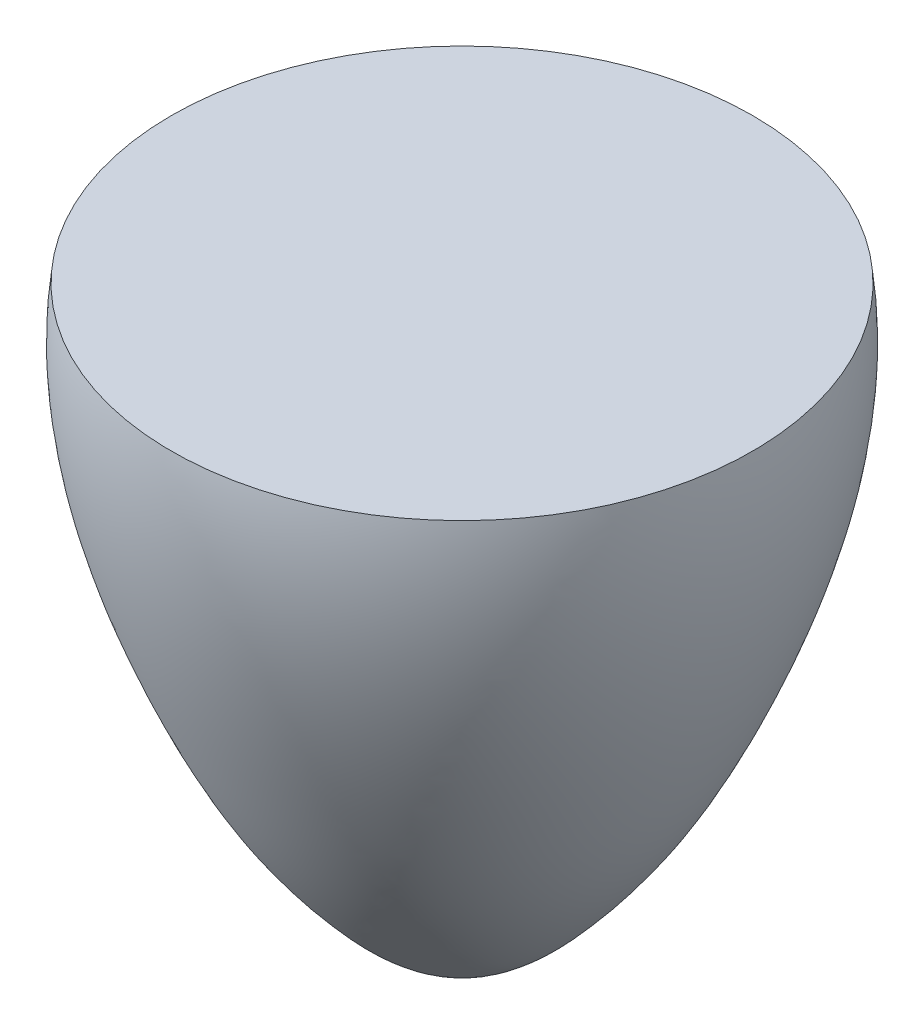
ISO-10303-21;
HEADER;
FILE_DESCRIPTION(('STEP AP214'),'2;1');
FILE_NAME('part.step','',(''),(''),'','','');
FILE_SCHEMA(('AUTOMOTIVE_DESIGN { 1 0 10303 214 1 1 1 1 }'));
ENDSEC;
DATA;
#1=APPLICATION_CONTEXT('core data for automotive mechanical design processes');
#2=APPLICATION_PROTOCOL_DEFINITION('international standard','automotive_design',2000,#1);
#3=PRODUCT_CONTEXT('',#1,'mechanical');
#4=PRODUCT('Part','Part','',(#3));
#5=PRODUCT_RELATED_PRODUCT_CATEGORY('part','',(#4));
#6=PRODUCT_DEFINITION_FORMATION('','',#4);
#7=PRODUCT_DEFINITION_CONTEXT('part definition',#1,'design');
#8=PRODUCT_DEFINITION('design','',#6,#7);
#9=PRODUCT_DEFINITION_SHAPE('','',#8);
#10=(LENGTH_UNIT() NAMED_UNIT(*) SI_UNIT(.MILLI.,.METRE.));
#11=(NAMED_UNIT(*) PLANE_ANGLE_UNIT() SI_UNIT($,.RADIAN.));
#12=(NAMED_UNIT(*) SI_UNIT($,.STERADIAN.) SOLID_ANGLE_UNIT());
#13=UNCERTAINTY_MEASURE_WITH_UNIT(LENGTH_MEASURE(1.E-05),#10,'distance_accuracy_value','');
#14=(GEOMETRIC_REPRESENTATION_CONTEXT(3) GLOBAL_UNCERTAINTY_ASSIGNED_CONTEXT((#13)) GLOBAL_UNIT_ASSIGNED_CONTEXT((#10,
#11,#12)) REPRESENTATION_CONTEXT('',''));
#15=CARTESIAN_POINT('',(0.,0.,0.));
#16=DIRECTION('',(0.,0.,1.));
#17=DIRECTION('',(1.,0.,0.));
#18=AXIS2_PLACEMENT_3D('',#15,#16,#17);
#19=CARTESIAN_POINT('',(-10.1851063937969,20.4,0.));
#20=CARTESIAN_POINT('',(-10.4948364105817,17.9900090605623,0.));
#21=CARTESIAN_POINT('',(-9.91702242227313,14.1532870666713,0.));
#22=CARTESIAN_POINT('',(-8.078941368624,9.2076203160626,0.));
#23=CARTESIAN_POINT('',(-6.3140837559433,5.57477105972202,0.));
#24=CARTESIAN_POINT('',(-3.81395499592637,2.17083220390568,0.));
#25=CARTESIAN_POINT('',(-1.73818336424504,0.214402458234915,0.));
#26=CARTESIAN_POINT('',(0.,0.,0.));
#27=B_SPLINE_CURVE_WITH_KNOTS('',3,(#19,#20,#21,#22,#23,#24,#25,#26),.UNSPECIFIED.,.F.,.F.,(4,1,
1,1,1,4),(0.,0.298524309143964,0.475099686738239,0.655211355503549,0.797800791531674,1.),.UNSPECIFIED.);
#28=CARTESIAN_POINT('',(0.,6.41897696713081,0.));
#29=DIRECTION('',(0.,-1.,0.));
#30=AXIS1_PLACEMENT('',#28,#29);
#31=SURFACE_OF_REVOLUTION('',#27,#30);
#32=CARTESIAN_POINT('',(0.,0.,0.));
#33=VERTEX_POINT('',#32);
#34=VERTEX_LOOP('',#33);
#35=FACE_BOUND('',#34,.T.);
#36=CARTESIAN_POINT('',(0.,20.4,0.));
#37=DIRECTION('',(0.,-1.,0.));
#38=DIRECTION('',(0.,0.,-1.));
#39=AXIS2_PLACEMENT_3D('',#36,#37,#38);
#40=CIRCLE('',#39,10.1851063937969);
#41=CARTESIAN_POINT('',(0.,20.4,-10.1851063937969));
#42=VERTEX_POINT('',#41);
#43=EDGE_CURVE('E11',#42,#42,#40,.T.);
#44=ORIENTED_EDGE('',*,*,#43,.T.);
#45=EDGE_LOOP('',(#44));
#46=FACE_BOUND('',#45,.T.);
#47=ADVANCED_FACE('F33',(#35,#46),#31,.T.);
#48=CARTESIAN_POINT('',(0.,20.4,0.));
#49=DIRECTION('',(0.,-1.,0.));
#50=DIRECTION('',(0.,0.,-1.));
#51=AXIS2_PLACEMENT_3D('',#48,#49,#50);
#52=PLANE('',#51);
#53=ORIENTED_EDGE('',*,*,#43,.F.);
#54=EDGE_LOOP('',(#53));
#55=FACE_BOUND('',#54,.T.);
#56=ADVANCED_FACE('F43',(#55),#52,.F.);
#57=CLOSED_SHELL('',(#47,#56));
#58=MANIFOLD_SOLID_BREP('B2',#57);
#59=ADVANCED_BREP_SHAPE_REPRESENTATION('',(#18,#58),#14);
#60=SHAPE_DEFINITION_REPRESENTATION(#9,#59);
ENDSEC;
END-ISO-10303-21;
